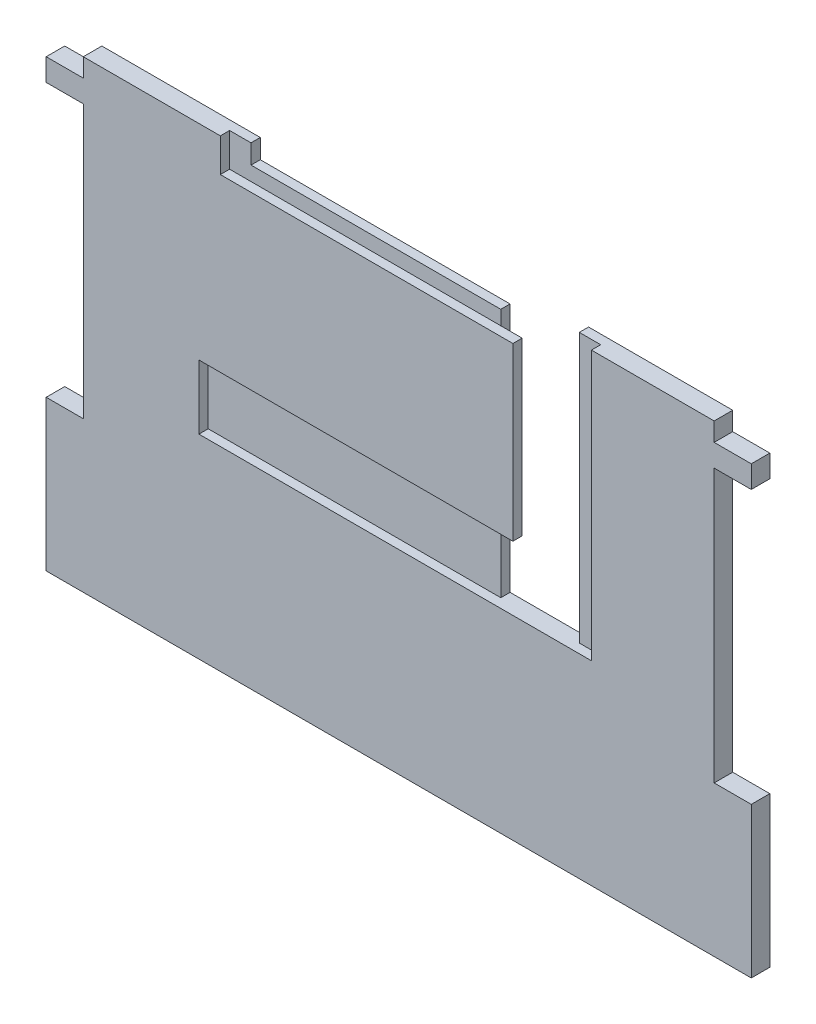
ISO-10303-21;
HEADER;
FILE_DESCRIPTION(('STEP AP214'),'2;1');
FILE_NAME('part.step','',(''),(''),'','','');
FILE_SCHEMA(('AUTOMOTIVE_DESIGN { 1 0 10303 214 1 1 1 1 }'));
ENDSEC;
DATA;
#1=APPLICATION_CONTEXT('core data for automotive mechanical design processes');
#2=APPLICATION_PROTOCOL_DEFINITION('international standard','automotive_design',2000,#1);
#3=PRODUCT_CONTEXT('',#1,'mechanical');
#4=PRODUCT('Part','Part','',(#3));
#5=PRODUCT_RELATED_PRODUCT_CATEGORY('part','',(#4));
#6=PRODUCT_DEFINITION_FORMATION('','',#4);
#7=PRODUCT_DEFINITION_CONTEXT('part definition',#1,'design');
#8=PRODUCT_DEFINITION('design','',#6,#7);
#9=PRODUCT_DEFINITION_SHAPE('','',#8);
#10=(LENGTH_UNIT() NAMED_UNIT(*) SI_UNIT(.MILLI.,.METRE.));
#11=(NAMED_UNIT(*) PLANE_ANGLE_UNIT() SI_UNIT($,.RADIAN.));
#12=(NAMED_UNIT(*) SI_UNIT($,.STERADIAN.) SOLID_ANGLE_UNIT());
#13=UNCERTAINTY_MEASURE_WITH_UNIT(LENGTH_MEASURE(1.E-05),#10,'distance_accuracy_value','');
#14=(GEOMETRIC_REPRESENTATION_CONTEXT(3) GLOBAL_UNCERTAINTY_ASSIGNED_CONTEXT((#13)) GLOBAL_UNIT_ASSIGNED_CONTEXT((#10,
#11,#12)) REPRESENTATION_CONTEXT('',''));
#15=CARTESIAN_POINT('',(0.,0.,0.));
#16=DIRECTION('',(0.,0.,1.));
#17=DIRECTION('',(1.,0.,0.));
#18=AXIS2_PLACEMENT_3D('',#15,#16,#17);
#19=CARTESIAN_POINT('',(-17.,-0.5,1.));
#20=DIRECTION('',(0.,-1.,0.));
#21=DIRECTION('',(0.,0.,-1.));
#22=AXIS2_PLACEMENT_3D('',#19,#20,#21);
#23=PLANE('',#22);
#24=DIRECTION('',(0.,0.,1.));
#25=VECTOR('',#24,1.);
#26=CARTESIAN_POINT('',(-9.61538461538565,-0.5,1.));
#27=LINE('',#26,#25);
#28=CARTESIAN_POINT('',(-9.61538461538565,-0.5,0.5));
#29=VERTEX_POINT('',#28);
#30=CARTESIAN_POINT('',(-9.61538461538565,-0.5,1.));
#31=VERTEX_POINT('',#30);
#32=EDGE_CURVE('E11',#29,#31,#27,.T.);
#33=ORIENTED_EDGE('',*,*,#32,.F.);
#34=DIRECTION('',(1.,0.,0.));
#35=VECTOR('',#34,1.);
#36=CARTESIAN_POINT('',(-17.,-0.5,0.5));
#37=LINE('',#36,#35);
#38=CARTESIAN_POINT('',(-8.46153846153845,-0.499999999999999,0.5));
#39=VERTEX_POINT('',#38);
#40=EDGE_CURVE('E207',#29,#39,#37,.T.);
#41=ORIENTED_EDGE('',*,*,#40,.T.);
#42=DIRECTION('',(0.,0.,1.));
#43=VECTOR('',#42,1.);
#44=CARTESIAN_POINT('',(-8.46153846153845,-0.5,1.));
#45=LINE('',#44,#43);
#46=CARTESIAN_POINT('',(-8.46153846153845,-0.5,0.));
#47=VERTEX_POINT('',#46);
#48=EDGE_CURVE('E165',#47,#39,#45,.T.);
#49=ORIENTED_EDGE('',*,*,#48,.F.);
#50=DIRECTION('',(1.,0.,0.));
#51=VECTOR('',#50,1.);
#52=CARTESIAN_POINT('',(-17.,-0.5,0.));
#53=LINE('',#52,#51);
#54=CARTESIAN_POINT('',(-17.,-0.5,0.));
#55=VERTEX_POINT('',#54);
#56=EDGE_CURVE('E133',#47,#55,#53,.F.);
#57=ORIENTED_EDGE('',*,*,#56,.T.);
#58=DIRECTION('',(0.,0.,-1.));
#59=VECTOR('',#58,1.);
#60=CARTESIAN_POINT('',(-17.,-0.5,1.));
#61=LINE('',#60,#59);
#62=CARTESIAN_POINT('',(-17.,-0.5,1.));
#63=VERTEX_POINT('',#62);
#64=EDGE_CURVE('E127',#63,#55,#61,.T.);
#65=ORIENTED_EDGE('',*,*,#64,.F.);
#66=DIRECTION('',(-1.,0.,0.));
#67=VECTOR('',#66,1.);
#68=CARTESIAN_POINT('',(-17.,-0.5,1.));
#69=LINE('',#68,#67);
#70=EDGE_CURVE('E283',#31,#63,#69,.T.);
#71=ORIENTED_EDGE('',*,*,#70,.F.);
#72=EDGE_LOOP('',(#33,#41,#49,#57,#65,#71));
#73=FACE_BOUND('',#72,.T.);
#74=ADVANCED_FACE('F39',(#73),#23,.F.);
#75=DIRECTION('',(0.,0.,-1.));
#76=VECTOR('',#75,1.);
#77=CARTESIAN_POINT('',(10.3846153846144,-0.5,1.));
#78=LINE('',#77,#76);
#79=CARTESIAN_POINT('',(10.3846153846144,-0.5,1.));
#80=VERTEX_POINT('',#79);
#81=CARTESIAN_POINT('',(10.3846153846144,-0.5,0.5));
#82=VERTEX_POINT('',#81);
#83=EDGE_CURVE('E48',#80,#82,#78,.T.);
#84=ORIENTED_EDGE('',*,*,#83,.F.);
#85=CARTESIAN_POINT('',(17.,-0.5,1.));
#86=VERTEX_POINT('',#85);
#87=EDGE_CURVE('E287',#86,#80,#69,.T.);
#88=ORIENTED_EDGE('',*,*,#87,.F.);
#89=DIRECTION('',(0.,0.,-1.));
#90=VECTOR('',#89,1.);
#91=CARTESIAN_POINT('',(17.,-0.5,1.));
#92=LINE('',#91,#90);
#93=CARTESIAN_POINT('',(17.,-0.5,0.));
#94=VERTEX_POINT('',#93);
#95=EDGE_CURVE('E243',#86,#94,#92,.T.);
#96=ORIENTED_EDGE('',*,*,#95,.T.);
#97=DIRECTION('',(1.,0.,0.));
#98=VECTOR('',#97,1.);
#99=CARTESIAN_POINT('',(-17.,-0.5,0.));
#100=LINE('',#99,#98);
#101=CARTESIAN_POINT('',(9.23076923076924,-0.5,0.));
#102=VERTEX_POINT('',#101);
#103=EDGE_CURVE('E334',#94,#102,#100,.F.);
#104=ORIENTED_EDGE('',*,*,#103,.T.);
#105=DIRECTION('',(0.,0.,-1.));
#106=VECTOR('',#105,1.);
#107=CARTESIAN_POINT('',(9.23076923076924,-0.5,1.));
#108=LINE('',#107,#106);
#109=CARTESIAN_POINT('',(9.23076923076924,-0.5,0.5));
#110=VERTEX_POINT('',#109);
#111=EDGE_CURVE('E160',#110,#102,#108,.T.);
#112=ORIENTED_EDGE('',*,*,#111,.F.);
#113=EDGE_CURVE('E203',#110,#82,#37,.T.);
#114=ORIENTED_EDGE('',*,*,#113,.T.);
#115=EDGE_LOOP('',(#84,#88,#96,#104,#112,#114));
#116=FACE_BOUND('',#115,.T.);
#117=ADVANCED_FACE('F482',(#116),#23,.F.);
#118=CARTESIAN_POINT('',(0.,0.,0.5));
#119=DIRECTION('',(0.,0.,1.));
#120=DIRECTION('',(1.,0.,0.));
#121=AXIS2_PLACEMENT_3D('',#118,#119,#120);
#122=PLANE('',#121);
#123=DIRECTION('',(1.,0.,0.));
#124=VECTOR('',#123,1.);
#125=CARTESIAN_POINT('',(-10.7692307692318,-11.5384615384615,0.5));
#126=LINE('',#125,#124);
#127=CARTESIAN_POINT('',(5.00000000000001,-11.5384615384615,0.5));
#128=VERTEX_POINT('',#127);
#129=CARTESIAN_POINT('',(6.15384615384512,-11.5384615384615,0.5));
#130=VERTEX_POINT('',#129);
#131=EDGE_CURVE('E509',#128,#130,#126,.T.);
#132=ORIENTED_EDGE('',*,*,#131,.F.);
#133=DIRECTION('',(0.,-1.,0.));
#134=VECTOR('',#133,1.);
#135=CARTESIAN_POINT('',(5.00000000000001,-1.53846153846154,0.5));
#136=LINE('',#135,#134);
#137=CARTESIAN_POINT('',(5.00000000000001,-2.30769230769231,0.5));
#138=VERTEX_POINT('',#137);
#139=EDGE_CURVE('E222',#138,#128,#136,.T.);
#140=ORIENTED_EDGE('',*,*,#139,.F.);
#141=DIRECTION('',(-1.,0.,0.));
#142=VECTOR('',#141,1.);
#143=CARTESIAN_POINT('',(6.15384615384512,-2.30769230769231,0.5));
#144=LINE('',#143,#142);
#145=CARTESIAN_POINT('',(6.15384615384512,-2.30769230769231,0.5));
#146=VERTEX_POINT('',#145);
#147=EDGE_CURVE('E519',#146,#138,#144,.T.);
#148=ORIENTED_EDGE('',*,*,#147,.F.);
#149=DIRECTION('',(0.,1.,0.));
#150=VECTOR('',#149,1.);
#151=CARTESIAN_POINT('',(6.15384615384512,-11.5384615384615,0.5));
#152=LINE('',#151,#150);
#153=EDGE_CURVE('E517',#130,#146,#152,.T.);
#154=ORIENTED_EDGE('',*,*,#153,.F.);
#155=EDGE_LOOP('',(#132,#140,#148,#154));
#156=FACE_BOUND('',#155,.T.);
#157=ADVANCED_FACE('F589',(#156),#122,.F.);
#158=CARTESIAN_POINT('',(0.,0.,0.));
#159=DIRECTION('',(0.,0.,-1.));
#160=DIRECTION('',(-1.,0.,0.));
#161=AXIS2_PLACEMENT_3D('',#158,#159,#160);
#162=PLANE('',#161);
#163=ORIENTED_EDGE('',*,*,#56,.F.);
#164=DIRECTION('',(0.,-1.,0.));
#165=VECTOR('',#164,1.);
#166=CARTESIAN_POINT('',(-8.46153846153845,1.92307692307692,0.));
#167=LINE('',#166,#165);
#168=CARTESIAN_POINT('',(-8.46153846153845,-1.53846153846154,0.));
#169=VERTEX_POINT('',#168);
#170=EDGE_CURVE('E326',#47,#169,#167,.T.);
#171=ORIENTED_EDGE('',*,*,#170,.T.);
#172=DIRECTION('',(1.,0.,0.));
#173=VECTOR('',#172,1.);
#174=CARTESIAN_POINT('',(-8.46153846153845,-1.53846153846154,0.));
#175=LINE('',#174,#173);
#176=CARTESIAN_POINT('',(5.00000000000001,-1.53846153846154,0.));
#177=VERTEX_POINT('',#176);
#178=EDGE_CURVE('E230',#169,#177,#175,.T.);
#179=ORIENTED_EDGE('',*,*,#178,.T.);
#180=DIRECTION('',(0.,-1.,0.));
#181=VECTOR('',#180,1.);
#182=CARTESIAN_POINT('',(5.00000000000001,-1.53846153846154,0.));
#183=LINE('',#182,#181);
#184=CARTESIAN_POINT('',(5.00000000000001,-15.,0.));
#185=VERTEX_POINT('',#184);
#186=EDGE_CURVE('E211',#177,#185,#183,.T.);
#187=ORIENTED_EDGE('',*,*,#186,.T.);
#188=DIRECTION('',(1.,0.,0.));
#189=VECTOR('',#188,1.);
#190=CARTESIAN_POINT('',(5.00000000000001,-15.,0.));
#191=LINE('',#190,#189);
#192=CARTESIAN_POINT('',(9.23076923076924,-15.,0.));
#193=VERTEX_POINT('',#192);
#194=EDGE_CURVE('E57',#185,#193,#191,.T.);
#195=ORIENTED_EDGE('',*,*,#194,.T.);
#196=DIRECTION('',(0.,1.,0.));
#197=VECTOR('',#196,1.);
#198=CARTESIAN_POINT('',(9.23076923076924,-15.,0.));
#199=LINE('',#198,#197);
#200=EDGE_CURVE('E226',#193,#102,#199,.T.);
#201=ORIENTED_EDGE('',*,*,#200,.T.);
#202=ORIENTED_EDGE('',*,*,#103,.F.);
#203=DIRECTION('',(0.,1.,0.));
#204=VECTOR('',#203,1.);
#205=CARTESIAN_POINT('',(17.,-0.5,0.));
#206=LINE('',#205,#204);
#207=CARTESIAN_POINT('',(17.,-1.5,0.));
#208=VERTEX_POINT('',#207);
#209=EDGE_CURVE('E290',#208,#94,#206,.T.);
#210=ORIENTED_EDGE('',*,*,#209,.F.);
#211=DIRECTION('',(1.,0.,0.));
#212=VECTOR('',#211,1.);
#213=CARTESIAN_POINT('',(17.,-1.5,0.));
#214=LINE('',#213,#212);
#215=CARTESIAN_POINT('',(19.,-1.5,0.));
#216=VERTEX_POINT('',#215);
#217=EDGE_CURVE('E342',#216,#208,#214,.F.);
#218=ORIENTED_EDGE('',*,*,#217,.F.);
#219=DIRECTION('',(0.,1.,0.));
#220=VECTOR('',#219,1.);
#221=CARTESIAN_POINT('',(19.,-1.5,0.));
#222=LINE('',#221,#220);
#223=CARTESIAN_POINT('',(19.,-2.7,0.));
#224=VERTEX_POINT('',#223);
#225=EDGE_CURVE('E345',#224,#216,#222,.T.);
#226=ORIENTED_EDGE('',*,*,#225,.F.);
#227=DIRECTION('',(1.,0.,0.));
#228=VECTOR('',#227,1.);
#229=CARTESIAN_POINT('',(19.,-2.7,0.));
#230=LINE('',#229,#228);
#231=CARTESIAN_POINT('',(17.,-2.7,0.));
#232=VERTEX_POINT('',#231);
#233=EDGE_CURVE('E343',#232,#224,#230,.T.);
#234=ORIENTED_EDGE('',*,*,#233,.F.);
#235=DIRECTION('',(0.,1.,0.));
#236=VECTOR('',#235,1.);
#237=CARTESIAN_POINT('',(17.,-2.7,0.));
#238=LINE('',#237,#236);
#239=CARTESIAN_POINT('',(17.,-17.3947217067352,0.));
#240=VERTEX_POINT('',#239);
#241=EDGE_CURVE('E347',#240,#232,#238,.T.);
#242=ORIENTED_EDGE('',*,*,#241,.F.);
#243=DIRECTION('',(1.,0.,0.));
#244=VECTOR('',#243,1.);
#245=CARTESIAN_POINT('',(17.,-17.3947217067352,0.));
#246=LINE('',#245,#244);
#247=CARTESIAN_POINT('',(19.,-17.3947217067352,0.));
#248=VERTEX_POINT('',#247);
#249=EDGE_CURVE('E350',#248,#240,#246,.F.);
#250=ORIENTED_EDGE('',*,*,#249,.F.);
#251=DIRECTION('',(0.,1.,0.));
#252=VECTOR('',#251,1.);
#253=CARTESIAN_POINT('',(19.,-17.3947217067352,0.));
#254=LINE('',#253,#252);
#255=CARTESIAN_POINT('',(19.,-25.5,0.));
#256=VERTEX_POINT('',#255);
#257=EDGE_CURVE('E353',#256,#248,#254,.T.);
#258=ORIENTED_EDGE('',*,*,#257,.F.);
#259=DIRECTION('',(1.,0.,0.));
#260=VECTOR('',#259,1.);
#261=CARTESIAN_POINT('',(19.,-25.5,0.));
#262=LINE('',#261,#260);
#263=CARTESIAN_POINT('',(-19.,-25.5,0.));
#264=VERTEX_POINT('',#263);
#265=EDGE_CURVE('E351',#264,#256,#262,.T.);
#266=ORIENTED_EDGE('',*,*,#265,.F.);
#267=DIRECTION('',(0.,1.,0.));
#268=VECTOR('',#267,1.);
#269=CARTESIAN_POINT('',(-19.,-25.5,0.));
#270=LINE('',#269,#268);
#271=CARTESIAN_POINT('',(-19.,-17.3947217067352,0.));
#272=VERTEX_POINT('',#271);
#273=EDGE_CURVE('E352',#272,#264,#270,.F.);
#274=ORIENTED_EDGE('',*,*,#273,.F.);
#275=DIRECTION('',(1.,0.,0.));
#276=VECTOR('',#275,1.);
#277=CARTESIAN_POINT('',(-19.,-17.3947217067352,0.));
#278=LINE('',#277,#276);
#279=CARTESIAN_POINT('',(-17.,-17.3947217067352,0.));
#280=VERTEX_POINT('',#279);
#281=EDGE_CURVE('E360',#280,#272,#278,.F.);
#282=ORIENTED_EDGE('',*,*,#281,.F.);
#283=DIRECTION('',(0.,1.,0.));
#284=VECTOR('',#283,1.);
#285=CARTESIAN_POINT('',(-17.,-17.3947217067352,0.));
#286=LINE('',#285,#284);
#287=CARTESIAN_POINT('',(-17.,-2.7,0.));
#288=VERTEX_POINT('',#287);
#289=EDGE_CURVE('E357',#288,#280,#286,.F.);
#290=ORIENTED_EDGE('',*,*,#289,.F.);
#291=DIRECTION('',(1.,0.,0.));
#292=VECTOR('',#291,1.);
#293=CARTESIAN_POINT('',(-17.,-2.7,0.));
#294=LINE('',#293,#292);
#295=CARTESIAN_POINT('',(-19.,-2.7,0.));
#296=VERTEX_POINT('',#295);
#297=EDGE_CURVE('E144',#296,#288,#294,.T.);
#298=ORIENTED_EDGE('',*,*,#297,.F.);
#299=DIRECTION('',(0.,1.,0.));
#300=VECTOR('',#299,1.);
#301=CARTESIAN_POINT('',(-19.,-2.7,0.));
#302=LINE('',#301,#300);
#303=CARTESIAN_POINT('',(-19.,-1.5,0.));
#304=VERTEX_POINT('',#303);
#305=EDGE_CURVE('E142',#304,#296,#302,.F.);
#306=ORIENTED_EDGE('',*,*,#305,.F.);
#307=DIRECTION('',(1.,0.,0.));
#308=VECTOR('',#307,1.);
#309=CARTESIAN_POINT('',(-19.,-1.5,0.));
#310=LINE('',#309,#308);
#311=CARTESIAN_POINT('',(-17.,-1.5,0.));
#312=VERTEX_POINT('',#311);
#313=EDGE_CURVE('E117',#312,#304,#310,.F.);
#314=ORIENTED_EDGE('',*,*,#313,.F.);
#315=DIRECTION('',(0.,1.,0.));
#316=VECTOR('',#315,1.);
#317=CARTESIAN_POINT('',(-17.,-1.5,0.));
#318=LINE('',#317,#316);
#319=EDGE_CURVE('E121',#55,#312,#318,.F.);
#320=ORIENTED_EDGE('',*,*,#319,.F.);
#321=EDGE_LOOP('',(#163,#171,#179,#187,#195,#201,#202,#210,#218,#226,#234,#242,#250,#258,#266,
#274,#282,#290,#298,#306,#314,#320));
#322=FACE_BOUND('',#321,.T.);
#323=ADVANCED_FACE('F141',(#322),#162,.T.);
#324=CARTESIAN_POINT('',(-17.,-1.5,1.));
#325=DIRECTION('',(1.,0.,0.));
#326=DIRECTION('',(0.,0.,-1.));
#327=AXIS2_PLACEMENT_3D('',#324,#325,#326);
#328=PLANE('',#327);
#329=ORIENTED_EDGE('',*,*,#319,.T.);
#330=DIRECTION('',(0.,0.,-1.));
#331=VECTOR('',#330,1.);
#332=CARTESIAN_POINT('',(-17.,-1.5,1.));
#333=LINE('',#332,#331);
#334=CARTESIAN_POINT('',(-17.,-1.5,1.));
#335=VERTEX_POINT('',#334);
#336=EDGE_CURVE('E130',#335,#312,#333,.T.);
#337=ORIENTED_EDGE('',*,*,#336,.F.);
#338=DIRECTION('',(0.,-1.,0.));
#339=VECTOR('',#338,1.);
#340=CARTESIAN_POINT('',(-17.,-1.5,1.));
#341=LINE('',#340,#339);
#342=EDGE_CURVE('E285',#63,#335,#341,.T.);
#343=ORIENTED_EDGE('',*,*,#342,.F.);
#344=ORIENTED_EDGE('',*,*,#64,.T.);
#345=EDGE_LOOP('',(#329,#337,#343,#344));
#346=FACE_BOUND('',#345,.T.);
#347=ADVANCED_FACE('F125',(#346),#328,.F.);
#348=CARTESIAN_POINT('',(-19.,-1.5,1.));
#349=DIRECTION('',(0.,-1.,0.));
#350=DIRECTION('',(1.,0.,0.));
#351=AXIS2_PLACEMENT_3D('',#348,#349,#350);
#352=PLANE('',#351);
#353=ORIENTED_EDGE('',*,*,#313,.T.);
#354=DIRECTION('',(0.,0.,-1.));
#355=VECTOR('',#354,1.);
#356=CARTESIAN_POINT('',(-19.,-1.5,1.));
#357=LINE('',#356,#355);
#358=CARTESIAN_POINT('',(-19.,-1.5,1.));
#359=VERTEX_POINT('',#358);
#360=EDGE_CURVE('E138',#359,#304,#357,.T.);
#361=ORIENTED_EDGE('',*,*,#360,.F.);
#362=DIRECTION('',(-1.,0.,0.));
#363=VECTOR('',#362,1.);
#364=CARTESIAN_POINT('',(-19.,-1.5,1.));
#365=LINE('',#364,#363);
#366=EDGE_CURVE('E140',#335,#359,#365,.T.);
#367=ORIENTED_EDGE('',*,*,#366,.F.);
#368=ORIENTED_EDGE('',*,*,#336,.T.);
#369=EDGE_LOOP('',(#353,#361,#367,#368));
#370=FACE_BOUND('',#369,.T.);
#371=ADVANCED_FACE('F134',(#370),#352,.F.);
#372=CARTESIAN_POINT('',(-19.,-2.7,1.));
#373=DIRECTION('',(1.,0.,0.));
#374=DIRECTION('',(0.,0.,-1.));
#375=AXIS2_PLACEMENT_3D('',#372,#373,#374);
#376=PLANE('',#375);
#377=ORIENTED_EDGE('',*,*,#305,.T.);
#378=DIRECTION('',(0.,0.,-1.));
#379=VECTOR('',#378,1.);
#380=CARTESIAN_POINT('',(-19.,-2.7,1.));
#381=LINE('',#380,#379);
#382=CARTESIAN_POINT('',(-19.,-2.7,1.));
#383=VERTEX_POINT('',#382);
#384=EDGE_CURVE('E292',#383,#296,#381,.T.);
#385=ORIENTED_EDGE('',*,*,#384,.F.);
#386=DIRECTION('',(0.,-1.,0.));
#387=VECTOR('',#386,1.);
#388=CARTESIAN_POINT('',(-19.,-2.7,1.));
#389=LINE('',#388,#387);
#390=EDGE_CURVE('E277',#359,#383,#389,.T.);
#391=ORIENTED_EDGE('',*,*,#390,.F.);
#392=ORIENTED_EDGE('',*,*,#360,.T.);
#393=EDGE_LOOP('',(#377,#385,#391,#392));
#394=FACE_BOUND('',#393,.T.);
#395=ADVANCED_FACE('F617',(#394),#376,.F.);
#396=CARTESIAN_POINT('',(-17.,-2.7,1.));
#397=DIRECTION('',(0.,1.,0.));
#398=DIRECTION('',(0.,0.,1.));
#399=AXIS2_PLACEMENT_3D('',#396,#397,#398);
#400=PLANE('',#399);
#401=ORIENTED_EDGE('',*,*,#297,.T.);
#402=DIRECTION('',(0.,0.,-1.));
#403=VECTOR('',#402,1.);
#404=CARTESIAN_POINT('',(-17.,-2.7,1.));
#405=LINE('',#404,#403);
#406=CARTESIAN_POINT('',(-17.,-2.7,1.));
#407=VERTEX_POINT('',#406);
#408=EDGE_CURVE('E294',#407,#288,#405,.T.);
#409=ORIENTED_EDGE('',*,*,#408,.F.);
#410=DIRECTION('',(1.,0.,0.));
#411=VECTOR('',#410,1.);
#412=CARTESIAN_POINT('',(-17.,-2.7,1.));
#413=LINE('',#412,#411);
#414=EDGE_CURVE('E274',#383,#407,#413,.T.);
#415=ORIENTED_EDGE('',*,*,#414,.F.);
#416=ORIENTED_EDGE('',*,*,#384,.T.);
#417=EDGE_LOOP('',(#401,#409,#415,#416));
#418=FACE_BOUND('',#417,.T.);
#419=ADVANCED_FACE('F365',(#418),#400,.F.);
#420=CARTESIAN_POINT('',(-17.,-17.3947217067352,1.));
#421=DIRECTION('',(1.,0.,0.));
#422=DIRECTION('',(0.,0.,-1.));
#423=AXIS2_PLACEMENT_3D('',#420,#421,#422);
#424=PLANE('',#423);
#425=ORIENTED_EDGE('',*,*,#289,.T.);
#426=DIRECTION('',(0.,0.,-1.));
#427=VECTOR('',#426,1.);
#428=CARTESIAN_POINT('',(-17.,-17.3947217067352,1.));
#429=LINE('',#428,#427);
#430=CARTESIAN_POINT('',(-17.,-17.3947217067352,1.));
#431=VERTEX_POINT('',#430);
#432=EDGE_CURVE('E299',#431,#280,#429,.T.);
#433=ORIENTED_EDGE('',*,*,#432,.F.);
#434=DIRECTION('',(0.,-1.,0.));
#435=VECTOR('',#434,1.);
#436=CARTESIAN_POINT('',(-17.,-17.3947217067352,1.));
#437=LINE('',#436,#435);
#438=EDGE_CURVE('E275',#407,#431,#437,.T.);
#439=ORIENTED_EDGE('',*,*,#438,.F.);
#440=ORIENTED_EDGE('',*,*,#408,.T.);
#441=EDGE_LOOP('',(#425,#433,#439,#440));
#442=FACE_BOUND('',#441,.T.);
#443=ADVANCED_FACE('F368',(#442),#424,.F.);
#444=CARTESIAN_POINT('',(-19.,-17.3947217067352,1.));
#445=DIRECTION('',(0.,-1.,0.));
#446=DIRECTION('',(0.,0.,-1.));
#447=AXIS2_PLACEMENT_3D('',#444,#445,#446);
#448=PLANE('',#447);
#449=ORIENTED_EDGE('',*,*,#281,.T.);
#450=DIRECTION('',(0.,0.,-1.));
#451=VECTOR('',#450,1.);
#452=CARTESIAN_POINT('',(-19.,-17.3947217067352,1.));
#453=LINE('',#452,#451);
#454=CARTESIAN_POINT('',(-19.,-17.3947217067352,1.));
#455=VERTEX_POINT('',#454);
#456=EDGE_CURVE('E298',#455,#272,#453,.T.);
#457=ORIENTED_EDGE('',*,*,#456,.F.);
#458=DIRECTION('',(-1.,0.,0.));
#459=VECTOR('',#458,1.);
#460=CARTESIAN_POINT('',(-19.,-17.3947217067352,1.));
#461=LINE('',#460,#459);
#462=EDGE_CURVE('E267',#431,#455,#461,.T.);
#463=ORIENTED_EDGE('',*,*,#462,.F.);
#464=ORIENTED_EDGE('',*,*,#432,.T.);
#465=EDGE_LOOP('',(#449,#457,#463,#464));
#466=FACE_BOUND('',#465,.T.);
#467=ADVANCED_FACE('F377',(#466),#448,.F.);
#468=CARTESIAN_POINT('',(-19.,-25.5,1.));
#469=DIRECTION('',(1.,0.,0.));
#470=DIRECTION('',(0.,0.,-1.));
#471=AXIS2_PLACEMENT_3D('',#468,#469,#470);
#472=PLANE('',#471);
#473=ORIENTED_EDGE('',*,*,#273,.T.);
#474=DIRECTION('',(0.,0.,-1.));
#475=VECTOR('',#474,1.);
#476=CARTESIAN_POINT('',(-19.,-25.5,1.));
#477=LINE('',#476,#475);
#478=CARTESIAN_POINT('',(-19.,-25.5,1.));
#479=VERTEX_POINT('',#478);
#480=EDGE_CURVE('E301',#479,#264,#477,.T.);
#481=ORIENTED_EDGE('',*,*,#480,.F.);
#482=DIRECTION('',(0.,-1.,0.));
#483=VECTOR('',#482,1.);
#484=CARTESIAN_POINT('',(-19.,-25.5,1.));
#485=LINE('',#484,#483);
#486=EDGE_CURVE('E266',#455,#479,#485,.T.);
#487=ORIENTED_EDGE('',*,*,#486,.F.);
#488=ORIENTED_EDGE('',*,*,#456,.T.);
#489=EDGE_LOOP('',(#473,#481,#487,#488));
#490=FACE_BOUND('',#489,.T.);
#491=ADVANCED_FACE('F382',(#490),#472,.F.);
#492=CARTESIAN_POINT('',(19.,-25.5,1.));
#493=DIRECTION('',(0.,1.,0.));
#494=DIRECTION('',(0.,0.,1.));
#495=AXIS2_PLACEMENT_3D('',#492,#493,#494);
#496=PLANE('',#495);
#497=ORIENTED_EDGE('',*,*,#265,.T.);
#498=DIRECTION('',(0.,0.,-1.));
#499=VECTOR('',#498,1.);
#500=CARTESIAN_POINT('',(19.,-25.5,1.));
#501=LINE('',#500,#499);
#502=CARTESIAN_POINT('',(19.,-25.5,1.));
#503=VERTEX_POINT('',#502);
#504=EDGE_CURVE('E308',#503,#256,#501,.T.);
#505=ORIENTED_EDGE('',*,*,#504,.F.);
#506=DIRECTION('',(1.,0.,0.));
#507=VECTOR('',#506,1.);
#508=CARTESIAN_POINT('',(19.,-25.5,1.));
#509=LINE('',#508,#507);
#510=EDGE_CURVE('E261',#479,#503,#509,.T.);
#511=ORIENTED_EDGE('',*,*,#510,.F.);
#512=ORIENTED_EDGE('',*,*,#480,.T.);
#513=EDGE_LOOP('',(#497,#505,#511,#512));
#514=FACE_BOUND('',#513,.T.);
#515=ADVANCED_FACE('F627',(#514),#496,.F.);
#516=CARTESIAN_POINT('',(19.,-17.3947217067352,1.));
#517=DIRECTION('',(-1.,0.,0.));
#518=DIRECTION('',(0.,0.,1.));
#519=AXIS2_PLACEMENT_3D('',#516,#517,#518);
#520=PLANE('',#519);
#521=ORIENTED_EDGE('',*,*,#257,.T.);
#522=DIRECTION('',(0.,0.,-1.));
#523=VECTOR('',#522,1.);
#524=CARTESIAN_POINT('',(19.,-17.3947217067352,1.));
#525=LINE('',#524,#523);
#526=CARTESIAN_POINT('',(19.,-17.3947217067352,1.));
#527=VERTEX_POINT('',#526);
#528=EDGE_CURVE('E309',#527,#248,#525,.T.);
#529=ORIENTED_EDGE('',*,*,#528,.F.);
#530=DIRECTION('',(0.,1.,0.));
#531=VECTOR('',#530,1.);
#532=CARTESIAN_POINT('',(19.,-17.3947217067352,1.));
#533=LINE('',#532,#531);
#534=EDGE_CURVE('E259',#503,#527,#533,.T.);
#535=ORIENTED_EDGE('',*,*,#534,.F.);
#536=ORIENTED_EDGE('',*,*,#504,.T.);
#537=EDGE_LOOP('',(#521,#529,#535,#536));
#538=FACE_BOUND('',#537,.T.);
#539=ADVANCED_FACE('F449',(#538),#520,.F.);
#540=CARTESIAN_POINT('',(17.,-17.3947217067352,1.));
#541=DIRECTION('',(0.,-1.,0.));
#542=DIRECTION('',(0.,0.,-1.));
#543=AXIS2_PLACEMENT_3D('',#540,#541,#542);
#544=PLANE('',#543);
#545=ORIENTED_EDGE('',*,*,#249,.T.);
#546=DIRECTION('',(0.,0.,-1.));
#547=VECTOR('',#546,1.);
#548=CARTESIAN_POINT('',(17.,-17.3947217067352,1.));
#549=LINE('',#548,#547);
#550=CARTESIAN_POINT('',(17.,-17.3947217067352,1.));
#551=VERTEX_POINT('',#550);
#552=EDGE_CURVE('E315',#551,#240,#549,.T.);
#553=ORIENTED_EDGE('',*,*,#552,.F.);
#554=DIRECTION('',(-1.,0.,0.));
#555=VECTOR('',#554,1.);
#556=CARTESIAN_POINT('',(17.,-17.3947217067352,1.));
#557=LINE('',#556,#555);
#558=EDGE_CURVE('E257',#527,#551,#557,.T.);
#559=ORIENTED_EDGE('',*,*,#558,.F.);
#560=ORIENTED_EDGE('',*,*,#528,.T.);
#561=EDGE_LOOP('',(#545,#553,#559,#560));
#562=FACE_BOUND('',#561,.T.);
#563=ADVANCED_FACE('F452',(#562),#544,.F.);
#564=CARTESIAN_POINT('',(17.,-2.7,1.));
#565=DIRECTION('',(-1.,0.,0.));
#566=DIRECTION('',(0.,0.,1.));
#567=AXIS2_PLACEMENT_3D('',#564,#565,#566);
#568=PLANE('',#567);
#569=ORIENTED_EDGE('',*,*,#241,.T.);
#570=DIRECTION('',(0.,0.,-1.));
#571=VECTOR('',#570,1.);
#572=CARTESIAN_POINT('',(17.,-2.7,1.));
#573=LINE('',#572,#571);
#574=CARTESIAN_POINT('',(17.,-2.7,1.));
#575=VERTEX_POINT('',#574);
#576=EDGE_CURVE('E314',#575,#232,#573,.T.);
#577=ORIENTED_EDGE('',*,*,#576,.F.);
#578=DIRECTION('',(0.,1.,0.));
#579=VECTOR('',#578,1.);
#580=CARTESIAN_POINT('',(17.,-2.7,1.));
#581=LINE('',#580,#579);
#582=EDGE_CURVE('E251',#551,#575,#581,.T.);
#583=ORIENTED_EDGE('',*,*,#582,.F.);
#584=ORIENTED_EDGE('',*,*,#552,.T.);
#585=EDGE_LOOP('',(#569,#577,#583,#584));
#586=FACE_BOUND('',#585,.T.);
#587=ADVANCED_FACE('F458',(#586),#568,.F.);
#588=CARTESIAN_POINT('',(19.,-2.7,1.));
#589=DIRECTION('',(0.,1.,0.));
#590=DIRECTION('',(0.,0.,1.));
#591=AXIS2_PLACEMENT_3D('',#588,#589,#590);
#592=PLANE('',#591);
#593=ORIENTED_EDGE('',*,*,#233,.T.);
#594=DIRECTION('',(0.,0.,-1.));
#595=VECTOR('',#594,1.);
#596=CARTESIAN_POINT('',(19.,-2.7,1.));
#597=LINE('',#596,#595);
#598=CARTESIAN_POINT('',(19.,-2.7,1.));
#599=VERTEX_POINT('',#598);
#600=EDGE_CURVE('E318',#599,#224,#597,.T.);
#601=ORIENTED_EDGE('',*,*,#600,.F.);
#602=DIRECTION('',(1.,0.,0.));
#603=VECTOR('',#602,1.);
#604=CARTESIAN_POINT('',(19.,-2.7,1.));
#605=LINE('',#604,#603);
#606=EDGE_CURVE('E252',#575,#599,#605,.T.);
#607=ORIENTED_EDGE('',*,*,#606,.F.);
#608=ORIENTED_EDGE('',*,*,#576,.T.);
#609=EDGE_LOOP('',(#593,#601,#607,#608));
#610=FACE_BOUND('',#609,.T.);
#611=ADVANCED_FACE('F463',(#610),#592,.F.);
#612=CARTESIAN_POINT('',(19.,-1.5,1.));
#613=DIRECTION('',(-1.,0.,0.));
#614=DIRECTION('',(0.,0.,1.));
#615=AXIS2_PLACEMENT_3D('',#612,#613,#614);
#616=PLANE('',#615);
#617=ORIENTED_EDGE('',*,*,#225,.T.);
#618=DIRECTION('',(0.,0.,-1.));
#619=VECTOR('',#618,1.);
#620=CARTESIAN_POINT('',(19.,-1.5,1.));
#621=LINE('',#620,#619);
#622=CARTESIAN_POINT('',(19.,-1.5,1.));
#623=VERTEX_POINT('',#622);
#624=EDGE_CURVE('E321',#623,#216,#621,.T.);
#625=ORIENTED_EDGE('',*,*,#624,.F.);
#626=DIRECTION('',(0.,1.,0.));
#627=VECTOR('',#626,1.);
#628=CARTESIAN_POINT('',(19.,-1.5,1.));
#629=LINE('',#628,#627);
#630=EDGE_CURVE('E246',#599,#623,#629,.T.);
#631=ORIENTED_EDGE('',*,*,#630,.F.);
#632=ORIENTED_EDGE('',*,*,#600,.T.);
#633=EDGE_LOOP('',(#617,#625,#631,#632));
#634=FACE_BOUND('',#633,.T.);
#635=ADVANCED_FACE('F466',(#634),#616,.F.);
#636=CARTESIAN_POINT('',(17.,-1.5,1.));
#637=DIRECTION('',(0.,-1.,0.));
#638=DIRECTION('',(1.,0.,0.));
#639=AXIS2_PLACEMENT_3D('',#636,#637,#638);
#640=PLANE('',#639);
#641=ORIENTED_EDGE('',*,*,#217,.T.);
#642=DIRECTION('',(0.,0.,-1.));
#643=VECTOR('',#642,1.);
#644=CARTESIAN_POINT('',(17.,-1.5,1.));
#645=LINE('',#644,#643);
#646=CARTESIAN_POINT('',(17.,-1.5,1.));
#647=VERTEX_POINT('',#646);
#648=EDGE_CURVE('E323',#647,#208,#645,.T.);
#649=ORIENTED_EDGE('',*,*,#648,.F.);
#650=DIRECTION('',(-1.,0.,0.));
#651=VECTOR('',#650,1.);
#652=CARTESIAN_POINT('',(17.,-1.5,1.));
#653=LINE('',#652,#651);
#654=EDGE_CURVE('E241',#623,#647,#653,.T.);
#655=ORIENTED_EDGE('',*,*,#654,.F.);
#656=ORIENTED_EDGE('',*,*,#624,.T.);
#657=EDGE_LOOP('',(#641,#649,#655,#656));
#658=FACE_BOUND('',#657,.T.);
#659=ADVANCED_FACE('F474',(#658),#640,.F.);
#660=CARTESIAN_POINT('',(17.,-0.5,1.));
#661=DIRECTION('',(-1.,0.,0.));
#662=DIRECTION('',(0.,0.,1.));
#663=AXIS2_PLACEMENT_3D('',#660,#661,#662);
#664=PLANE('',#663);
#665=ORIENTED_EDGE('',*,*,#209,.T.);
#666=ORIENTED_EDGE('',*,*,#95,.F.);
#667=DIRECTION('',(0.,1.,0.));
#668=VECTOR('',#667,1.);
#669=CARTESIAN_POINT('',(17.,-0.5,1.));
#670=LINE('',#669,#668);
#671=EDGE_CURVE('E242',#647,#86,#670,.T.);
#672=ORIENTED_EDGE('',*,*,#671,.F.);
#673=ORIENTED_EDGE('',*,*,#648,.T.);
#674=EDGE_LOOP('',(#665,#666,#672,#673));
#675=FACE_BOUND('',#674,.T.);
#676=ADVANCED_FACE('F476',(#675),#664,.F.);
#677=CARTESIAN_POINT('',(0.,0.,1.));
#678=DIRECTION('',(0.,0.,-1.));
#679=DIRECTION('',(-1.,0.,0.));
#680=AXIS2_PLACEMENT_3D('',#677,#678,#679);
#681=PLANE('',#680);
#682=DIRECTION('',(-1.,0.,0.));
#683=VECTOR('',#682,1.);
#684=CARTESIAN_POINT('',(6.15384615384512,-2.30769230769231,1.));
#685=LINE('',#684,#683);
#686=CARTESIAN_POINT('',(6.15384615384512,-2.30769230769231,1.));
#687=VERTEX_POINT('',#686);
#688=CARTESIAN_POINT('',(-9.61538461538565,-2.30769230769231,1.));
#689=VERTEX_POINT('',#688);
#690=EDGE_CURVE('E179',#687,#689,#685,.T.);
#691=ORIENTED_EDGE('',*,*,#690,.T.);
#692=DIRECTION('',(0.,1.,0.));
#693=VECTOR('',#692,1.);
#694=CARTESIAN_POINT('',(-9.61538461538565,-2.30769230769231,1.));
#695=LINE('',#694,#693);
#696=EDGE_CURVE('E183',#689,#31,#695,.T.);
#697=ORIENTED_EDGE('',*,*,#696,.T.);
#698=ORIENTED_EDGE('',*,*,#70,.T.);
#699=ORIENTED_EDGE('',*,*,#342,.T.);
#700=ORIENTED_EDGE('',*,*,#366,.T.);
#701=ORIENTED_EDGE('',*,*,#390,.T.);
#702=ORIENTED_EDGE('',*,*,#414,.T.);
#703=ORIENTED_EDGE('',*,*,#438,.T.);
#704=ORIENTED_EDGE('',*,*,#462,.T.);
#705=ORIENTED_EDGE('',*,*,#486,.T.);
#706=ORIENTED_EDGE('',*,*,#510,.T.);
#707=ORIENTED_EDGE('',*,*,#534,.T.);
#708=ORIENTED_EDGE('',*,*,#558,.T.);
#709=ORIENTED_EDGE('',*,*,#582,.T.);
#710=ORIENTED_EDGE('',*,*,#606,.T.);
#711=ORIENTED_EDGE('',*,*,#630,.T.);
#712=ORIENTED_EDGE('',*,*,#654,.T.);
#713=ORIENTED_EDGE('',*,*,#671,.T.);
#714=ORIENTED_EDGE('',*,*,#87,.T.);
#715=DIRECTION('',(0.,-1.,0.));
#716=VECTOR('',#715,1.);
#717=CARTESIAN_POINT('',(10.3846153846144,15.,1.));
#718=LINE('',#717,#716);
#719=CARTESIAN_POINT('',(10.3846153846144,-15.,1.));
#720=VERTEX_POINT('',#719);
#721=EDGE_CURVE('E146',#80,#720,#718,.T.);
#722=ORIENTED_EDGE('',*,*,#721,.T.);
#723=DIRECTION('',(-1.,0.,0.));
#724=VECTOR('',#723,1.);
#725=CARTESIAN_POINT('',(10.3846153846144,-15.,1.));
#726=LINE('',#725,#724);
#727=CARTESIAN_POINT('',(-10.7692307692318,-15.,1.));
#728=VERTEX_POINT('',#727);
#729=EDGE_CURVE('E170',#720,#728,#726,.T.);
#730=ORIENTED_EDGE('',*,*,#729,.T.);
#731=DIRECTION('',(0.,1.,0.));
#732=VECTOR('',#731,1.);
#733=CARTESIAN_POINT('',(-10.7692307692318,-15.,1.));
#734=LINE('',#733,#732);
#735=CARTESIAN_POINT('',(-10.7692307692318,-11.5384615384615,1.));
#736=VERTEX_POINT('',#735);
#737=EDGE_CURVE('E173',#728,#736,#734,.T.);
#738=ORIENTED_EDGE('',*,*,#737,.T.);
#739=DIRECTION('',(1.,0.,0.));
#740=VECTOR('',#739,1.);
#741=CARTESIAN_POINT('',(-10.7692307692318,-11.5384615384615,1.));
#742=LINE('',#741,#740);
#743=CARTESIAN_POINT('',(6.15384615384512,-11.5384615384615,1.));
#744=VERTEX_POINT('',#743);
#745=EDGE_CURVE('E174',#736,#744,#742,.T.);
#746=ORIENTED_EDGE('',*,*,#745,.T.);
#747=DIRECTION('',(0.,1.,0.));
#748=VECTOR('',#747,1.);
#749=CARTESIAN_POINT('',(6.15384615384512,-11.5384615384615,1.));
#750=LINE('',#749,#748);
#751=EDGE_CURVE('E180',#744,#687,#750,.T.);
#752=ORIENTED_EDGE('',*,*,#751,.T.);
#753=EDGE_LOOP('',(#691,#697,#698,#699,#700,#701,#702,#703,#704,#705,#706,#707,#708,#709,#710,
#711,#712,#713,#714,#722,#730,#738,#746,#752));
#754=FACE_BOUND('',#753,.T.);
#755=ADVANCED_FACE('F41',(#754),#681,.F.);
#756=CARTESIAN_POINT('',(9.23076923076924,-15.,0.5));
#757=DIRECTION('',(-1.,0.,0.));
#758=DIRECTION('',(0.,0.,1.));
#759=AXIS2_PLACEMENT_3D('',#756,#757,#758);
#760=PLANE('',#759);
#761=ORIENTED_EDGE('',*,*,#111,.T.);
#762=ORIENTED_EDGE('',*,*,#200,.F.);
#763=DIRECTION('',(0.,0.,-1.));
#764=VECTOR('',#763,1.);
#765=CARTESIAN_POINT('',(9.23076923076924,-15.,0.5));
#766=LINE('',#765,#764);
#767=CARTESIAN_POINT('',(9.23076923076924,-15.,0.5));
#768=VERTEX_POINT('',#767);
#769=EDGE_CURVE('E236',#768,#193,#766,.T.);
#770=ORIENTED_EDGE('',*,*,#769,.F.);
#771=DIRECTION('',(0.,1.,0.));
#772=VECTOR('',#771,1.);
#773=CARTESIAN_POINT('',(9.23076923076924,-15.,0.5));
#774=LINE('',#773,#772);
#775=EDGE_CURVE('E206',#768,#110,#774,.T.);
#776=ORIENTED_EDGE('',*,*,#775,.T.);
#777=EDGE_LOOP('',(#761,#762,#770,#776));
#778=FACE_BOUND('',#777,.T.);
#779=ADVANCED_FACE('F496',(#778),#760,.T.);
#780=CARTESIAN_POINT('',(-8.46153846153845,1.92307692307692,0.5));
#781=DIRECTION('',(1.,0.,0.));
#782=DIRECTION('',(0.,0.,-1.));
#783=AXIS2_PLACEMENT_3D('',#780,#781,#782);
#784=PLANE('',#783);
#785=ORIENTED_EDGE('',*,*,#48,.T.);
#786=DIRECTION('',(0.,-1.,0.));
#787=VECTOR('',#786,1.);
#788=CARTESIAN_POINT('',(-8.46153846153845,1.92307692307692,0.5));
#789=LINE('',#788,#787);
#790=CARTESIAN_POINT('',(-8.46153846153845,-1.53846153846154,0.5));
#791=VERTEX_POINT('',#790);
#792=EDGE_CURVE('E212',#39,#791,#789,.T.);
#793=ORIENTED_EDGE('',*,*,#792,.T.);
#794=DIRECTION('',(0.,0.,-1.));
#795=VECTOR('',#794,1.);
#796=CARTESIAN_POINT('',(-8.46153846153845,-1.53846153846154,0.5));
#797=LINE('',#796,#795);
#798=EDGE_CURVE('E237',#791,#169,#797,.T.);
#799=ORIENTED_EDGE('',*,*,#798,.T.);
#800=ORIENTED_EDGE('',*,*,#170,.F.);
#801=EDGE_LOOP('',(#785,#793,#799,#800));
#802=FACE_BOUND('',#801,.T.);
#803=ADVANCED_FACE('F415',(#802),#784,.T.);
#804=CARTESIAN_POINT('',(5.00000000000001,-15.,0.5));
#805=DIRECTION('',(0.,1.,0.));
#806=DIRECTION('',(0.,0.,1.));
#807=AXIS2_PLACEMENT_3D('',#804,#805,#806);
#808=PLANE('',#807);
#809=ORIENTED_EDGE('',*,*,#194,.F.);
#810=DIRECTION('',(0.,0.,-1.));
#811=VECTOR('',#810,1.);
#812=CARTESIAN_POINT('',(5.00000000000001,-15.,0.5));
#813=LINE('',#812,#811);
#814=CARTESIAN_POINT('',(5.00000000000001,-15.,0.5));
#815=VERTEX_POINT('',#814);
#816=EDGE_CURVE('E223',#815,#185,#813,.T.);
#817=ORIENTED_EDGE('',*,*,#816,.F.);
#818=DIRECTION('',(-1.,0.,0.));
#819=VECTOR('',#818,1.);
#820=CARTESIAN_POINT('',(10.3846153846144,-15.,0.5));
#821=LINE('',#820,#819);
#822=CARTESIAN_POINT('',(-10.7692307692318,-15.,0.5));
#823=VERTEX_POINT('',#822);
#824=EDGE_CURVE('E504',#815,#823,#821,.T.);
#825=ORIENTED_EDGE('',*,*,#824,.T.);
#826=DIRECTION('',(0.,0.,1.));
#827=VECTOR('',#826,1.);
#828=CARTESIAN_POINT('',(-10.7692307692318,-15.,0.5));
#829=LINE('',#828,#827);
#830=EDGE_CURVE('E196',#823,#728,#829,.T.);
#831=ORIENTED_EDGE('',*,*,#830,.T.);
#832=ORIENTED_EDGE('',*,*,#729,.F.);
#833=DIRECTION('',(0.,0.,1.));
#834=VECTOR('',#833,1.);
#835=CARTESIAN_POINT('',(10.3846153846144,-15.,0.5));
#836=LINE('',#835,#834);
#837=CARTESIAN_POINT('',(10.3846153846144,-15.,0.5));
#838=VERTEX_POINT('',#837);
#839=EDGE_CURVE('E205',#838,#720,#836,.T.);
#840=ORIENTED_EDGE('',*,*,#839,.F.);
#841=EDGE_CURVE('E501',#838,#768,#821,.T.);
#842=ORIENTED_EDGE('',*,*,#841,.T.);
#843=ORIENTED_EDGE('',*,*,#769,.T.);
#844=EDGE_LOOP('',(#809,#817,#825,#831,#832,#840,#842,#843));
#845=FACE_BOUND('',#844,.T.);
#846=ADVANCED_FACE('F497',(#845),#808,.T.);
#847=CARTESIAN_POINT('',(-8.46153846153845,-1.53846153846154,0.5));
#848=DIRECTION('',(0.,1.,0.));
#849=DIRECTION('',(0.,0.,1.));
#850=AXIS2_PLACEMENT_3D('',#847,#848,#849);
#851=PLANE('',#850);
#852=ORIENTED_EDGE('',*,*,#178,.F.);
#853=ORIENTED_EDGE('',*,*,#798,.F.);
#854=DIRECTION('',(1.,0.,0.));
#855=VECTOR('',#854,1.);
#856=CARTESIAN_POINT('',(-8.46153846153845,-1.53846153846154,0.5));
#857=LINE('',#856,#855);
#858=CARTESIAN_POINT('',(5.00000000000001,-1.53846153846154,0.5));
#859=VERTEX_POINT('',#858);
#860=EDGE_CURVE('E218',#791,#859,#857,.T.);
#861=ORIENTED_EDGE('',*,*,#860,.T.);
#862=DIRECTION('',(0.,0.,-1.));
#863=VECTOR('',#862,1.);
#864=CARTESIAN_POINT('',(5.00000000000001,-1.53846153846154,0.5));
#865=LINE('',#864,#863);
#866=EDGE_CURVE('E232',#859,#177,#865,.T.);
#867=ORIENTED_EDGE('',*,*,#866,.T.);
#868=EDGE_LOOP('',(#852,#853,#861,#867));
#869=FACE_BOUND('',#868,.T.);
#870=ADVANCED_FACE('F419',(#869),#851,.T.);
#871=CARTESIAN_POINT('',(5.00000000000001,-1.53846153846154,0.5));
#872=DIRECTION('',(1.,0.,0.));
#873=DIRECTION('',(0.,0.,-1.));
#874=AXIS2_PLACEMENT_3D('',#871,#872,#873);
#875=PLANE('',#874);
#876=ORIENTED_EDGE('',*,*,#186,.F.);
#877=ORIENTED_EDGE('',*,*,#866,.F.);
#878=EDGE_CURVE('E217',#859,#138,#136,.T.);
#879=ORIENTED_EDGE('',*,*,#878,.T.);
#880=ORIENTED_EDGE('',*,*,#139,.T.);
#881=EDGE_CURVE('E219',#128,#815,#136,.T.);
#882=ORIENTED_EDGE('',*,*,#881,.T.);
#883=ORIENTED_EDGE('',*,*,#816,.T.);
#884=EDGE_LOOP('',(#876,#877,#879,#880,#882,#883));
#885=FACE_BOUND('',#884,.T.);
#886=ADVANCED_FACE('F421',(#885),#875,.T.);
#887=CARTESIAN_POINT('',(10.3846153846144,15.,0.5));
#888=DIRECTION('',(-1.,0.,0.));
#889=DIRECTION('',(0.,0.,1.));
#890=AXIS2_PLACEMENT_3D('',#887,#888,#889);
#891=PLANE('',#890);
#892=ORIENTED_EDGE('',*,*,#83,.T.);
#893=DIRECTION('',(0.,-1.,0.));
#894=VECTOR('',#893,1.);
#895=CARTESIAN_POINT('',(10.3846153846144,15.,0.5));
#896=LINE('',#895,#894);
#897=EDGE_CURVE('E186',#82,#838,#896,.T.);
#898=ORIENTED_EDGE('',*,*,#897,.T.);
#899=ORIENTED_EDGE('',*,*,#839,.T.);
#900=ORIENTED_EDGE('',*,*,#721,.F.);
#901=EDGE_LOOP('',(#892,#898,#899,#900));
#902=FACE_BOUND('',#901,.T.);
#903=ADVANCED_FACE('F572',(#902),#891,.T.);
#904=CARTESIAN_POINT('',(-9.61538461538565,-2.30769230769231,0.5));
#905=DIRECTION('',(1.,0.,0.));
#906=DIRECTION('',(0.,0.,-1.));
#907=AXIS2_PLACEMENT_3D('',#904,#905,#906);
#908=PLANE('',#907);
#909=ORIENTED_EDGE('',*,*,#32,.T.);
#910=ORIENTED_EDGE('',*,*,#696,.F.);
#911=DIRECTION('',(0.,0.,1.));
#912=VECTOR('',#911,1.);
#913=CARTESIAN_POINT('',(-9.61538461538565,-2.30769230769231,0.5));
#914=LINE('',#913,#912);
#915=CARTESIAN_POINT('',(-9.61538461538565,-2.30769230769231,0.5));
#916=VERTEX_POINT('',#915);
#917=EDGE_CURVE('E190',#916,#689,#914,.T.);
#918=ORIENTED_EDGE('',*,*,#917,.F.);
#919=DIRECTION('',(0.,1.,0.));
#920=VECTOR('',#919,1.);
#921=CARTESIAN_POINT('',(-9.61538461538565,-2.30769230769231,0.5));
#922=LINE('',#921,#920);
#923=EDGE_CURVE('E167',#916,#29,#922,.T.);
#924=ORIENTED_EDGE('',*,*,#923,.T.);
#925=EDGE_LOOP('',(#909,#910,#918,#924));
#926=FACE_BOUND('',#925,.T.);
#927=ADVANCED_FACE('F537',(#926),#908,.T.);
#928=CARTESIAN_POINT('',(0.,0.,0.5));
#929=DIRECTION('',(0.,0.,-1.));
#930=DIRECTION('',(-1.,0.,0.));
#931=AXIS2_PLACEMENT_3D('',#928,#929,#930);
#932=PLANE('',#931);
#933=CARTESIAN_POINT('',(-10.7692307692318,-11.5384615384615,0.5));
#934=VERTEX_POINT('',#933);
#935=EDGE_CURVE('E515',#934,#128,#126,.T.);
#936=ORIENTED_EDGE('',*,*,#935,.F.);
#937=DIRECTION('',(0.,1.,0.));
#938=VECTOR('',#937,1.);
#939=CARTESIAN_POINT('',(-10.7692307692318,-15.,0.5));
#940=LINE('',#939,#938);
#941=EDGE_CURVE('E503',#823,#934,#940,.T.);
#942=ORIENTED_EDGE('',*,*,#941,.F.);
#943=ORIENTED_EDGE('',*,*,#824,.F.);
#944=ORIENTED_EDGE('',*,*,#881,.F.);
#945=EDGE_LOOP('',(#936,#942,#943,#944));
#946=FACE_BOUND('',#945,.T.);
#947=ADVANCED_FACE('F592',(#946),#932,.F.);
#948=ORIENTED_EDGE('',*,*,#923,.F.);
#949=EDGE_CURVE('E516',#138,#916,#144,.T.);
#950=ORIENTED_EDGE('',*,*,#949,.F.);
#951=ORIENTED_EDGE('',*,*,#878,.F.);
#952=ORIENTED_EDGE('',*,*,#860,.F.);
#953=ORIENTED_EDGE('',*,*,#792,.F.);
#954=ORIENTED_EDGE('',*,*,#40,.F.);
#955=EDGE_LOOP('',(#948,#950,#951,#952,#953,#954));
#956=FACE_BOUND('',#955,.T.);
#957=ADVANCED_FACE('F545',(#956),#932,.F.);
#958=ORIENTED_EDGE('',*,*,#841,.F.);
#959=ORIENTED_EDGE('',*,*,#897,.F.);
#960=ORIENTED_EDGE('',*,*,#113,.F.);
#961=ORIENTED_EDGE('',*,*,#775,.F.);
#962=EDGE_LOOP('',(#958,#959,#960,#961));
#963=FACE_BOUND('',#962,.T.);
#964=ADVANCED_FACE('F493',(#963),#932,.F.);
#965=CARTESIAN_POINT('',(-10.7692307692318,-15.,0.5));
#966=DIRECTION('',(1.,0.,0.));
#967=DIRECTION('',(0.,0.,-1.));
#968=AXIS2_PLACEMENT_3D('',#965,#966,#967);
#969=PLANE('',#968);
#970=ORIENTED_EDGE('',*,*,#737,.F.);
#971=ORIENTED_EDGE('',*,*,#830,.F.);
#972=ORIENTED_EDGE('',*,*,#941,.T.);
#973=DIRECTION('',(0.,0.,1.));
#974=VECTOR('',#973,1.);
#975=CARTESIAN_POINT('',(-10.7692307692318,-11.5384615384615,0.5));
#976=LINE('',#975,#974);
#977=EDGE_CURVE('E197',#934,#736,#976,.T.);
#978=ORIENTED_EDGE('',*,*,#977,.T.);
#979=EDGE_LOOP('',(#970,#971,#972,#978));
#980=FACE_BOUND('',#979,.T.);
#981=ADVANCED_FACE('F580',(#980),#969,.T.);
#982=CARTESIAN_POINT('',(-10.7692307692318,-11.5384615384615,0.5));
#983=DIRECTION('',(0.,-1.,0.));
#984=DIRECTION('',(0.,0.,-1.));
#985=AXIS2_PLACEMENT_3D('',#982,#983,#984);
#986=PLANE('',#985);
#987=ORIENTED_EDGE('',*,*,#745,.F.);
#988=ORIENTED_EDGE('',*,*,#977,.F.);
#989=ORIENTED_EDGE('',*,*,#935,.T.);
#990=ORIENTED_EDGE('',*,*,#131,.T.);
#991=DIRECTION('',(0.,0.,1.));
#992=VECTOR('',#991,1.);
#993=CARTESIAN_POINT('',(6.15384615384512,-11.5384615384615,0.5));
#994=LINE('',#993,#992);
#995=EDGE_CURVE('E194',#130,#744,#994,.T.);
#996=ORIENTED_EDGE('',*,*,#995,.T.);
#997=EDGE_LOOP('',(#987,#988,#989,#990,#996));
#998=FACE_BOUND('',#997,.T.);
#999=ADVANCED_FACE('F585',(#998),#986,.T.);
#1000=CARTESIAN_POINT('',(6.15384615384512,-11.5384615384615,0.5));
#1001=DIRECTION('',(1.,0.,0.));
#1002=DIRECTION('',(0.,0.,-1.));
#1003=AXIS2_PLACEMENT_3D('',#1000,#1001,#1002);
#1004=PLANE('',#1003);
#1005=ORIENTED_EDGE('',*,*,#751,.F.);
#1006=ORIENTED_EDGE('',*,*,#995,.F.);
#1007=ORIENTED_EDGE('',*,*,#153,.T.);
#1008=DIRECTION('',(0.,0.,1.));
#1009=VECTOR('',#1008,1.);
#1010=CARTESIAN_POINT('',(6.15384615384512,-2.30769230769231,0.5));
#1011=LINE('',#1010,#1009);
#1012=EDGE_CURVE('E189',#146,#687,#1011,.T.);
#1013=ORIENTED_EDGE('',*,*,#1012,.T.);
#1014=EDGE_LOOP('',(#1005,#1006,#1007,#1013));
#1015=FACE_BOUND('',#1014,.T.);
#1016=ADVANCED_FACE('F588',(#1015),#1004,.T.);
#1017=CARTESIAN_POINT('',(6.15384615384512,-2.30769230769231,0.5));
#1018=DIRECTION('',(0.,1.,0.));
#1019=DIRECTION('',(0.,0.,1.));
#1020=AXIS2_PLACEMENT_3D('',#1017,#1018,#1019);
#1021=PLANE('',#1020);
#1022=ORIENTED_EDGE('',*,*,#690,.F.);
#1023=ORIENTED_EDGE('',*,*,#1012,.F.);
#1024=ORIENTED_EDGE('',*,*,#147,.T.);
#1025=ORIENTED_EDGE('',*,*,#949,.T.);
#1026=ORIENTED_EDGE('',*,*,#917,.T.);
#1027=EDGE_LOOP('',(#1022,#1023,#1024,#1025,#1026));
#1028=FACE_BOUND('',#1027,.T.);
#1029=ADVANCED_FACE('F533',(#1028),#1021,.T.);
#1030=CLOSED_SHELL('',(#74,#117,#157,#323,#347,#371,#395,#419,#443,#467,#491,#515,#539,#563,
#587,#611,#635,#659,#676,#755,#779,#803,#846,#870,#886,#903,#927,#947,#957,#964,#981,#999,#1016,#1029));
#1031=MANIFOLD_SOLID_BREP('B2',#1030);
#1032=ADVANCED_BREP_SHAPE_REPRESENTATION('',(#18,#1031),#14);
#1033=SHAPE_DEFINITION_REPRESENTATION(#9,#1032);
ENDSEC;
END-ISO-10303-21;
